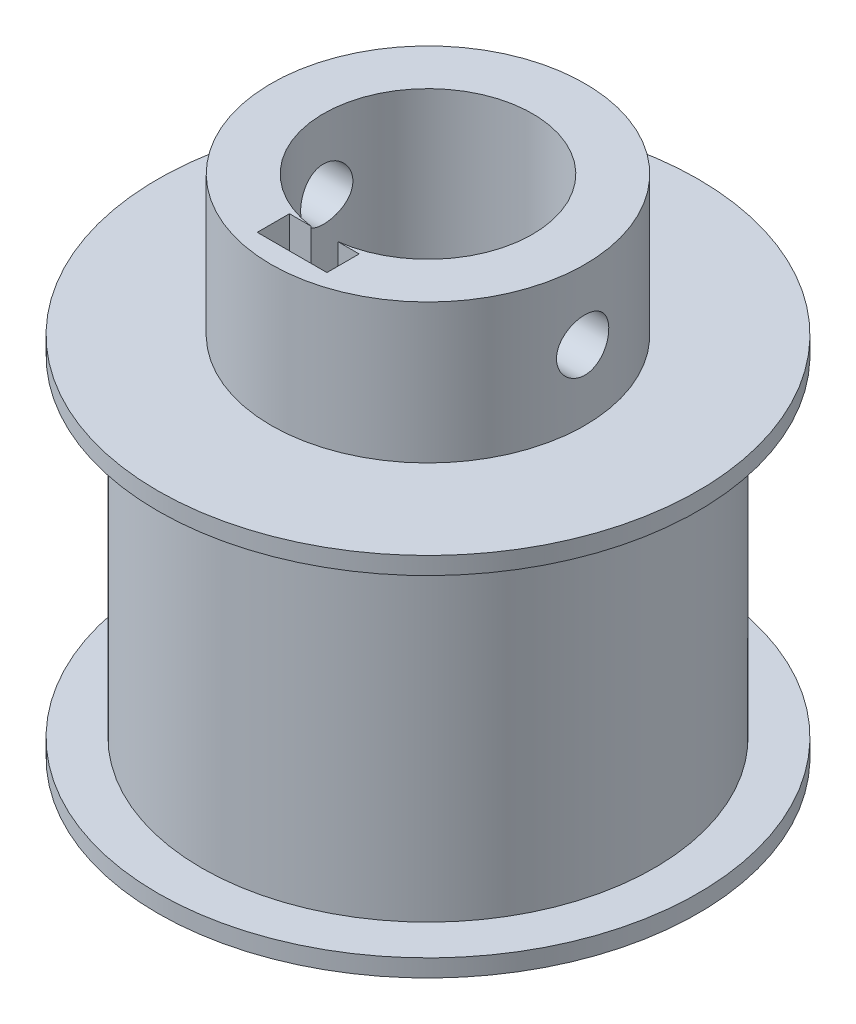
ISO-10303-21;
HEADER;
FILE_DESCRIPTION(('STEP AP214'),'2;1');
FILE_NAME('part.step','',(''),(''),'','','');
FILE_SCHEMA(('AUTOMOTIVE_DESIGN { 1 0 10303 214 1 1 1 1 }'));
ENDSEC;
DATA;
#1=APPLICATION_CONTEXT('core data for automotive mechanical design processes');
#2=APPLICATION_PROTOCOL_DEFINITION('international standard','automotive_design',2000,#1);
#3=PRODUCT_CONTEXT('',#1,'mechanical');
#4=PRODUCT('Part','Part','',(#3));
#5=PRODUCT_RELATED_PRODUCT_CATEGORY('part','',(#4));
#6=PRODUCT_DEFINITION_FORMATION('','',#4);
#7=PRODUCT_DEFINITION_CONTEXT('part definition',#1,'design');
#8=PRODUCT_DEFINITION('design','',#6,#7);
#9=PRODUCT_DEFINITION_SHAPE('','',#8);
#10=(LENGTH_UNIT() NAMED_UNIT(*) SI_UNIT(.MILLI.,.METRE.));
#11=(NAMED_UNIT(*) PLANE_ANGLE_UNIT() SI_UNIT($,.RADIAN.));
#12=(NAMED_UNIT(*) SI_UNIT($,.STERADIAN.) SOLID_ANGLE_UNIT());
#13=UNCERTAINTY_MEASURE_WITH_UNIT(LENGTH_MEASURE(1.E-05),#10,'distance_accuracy_value','');
#14=(GEOMETRIC_REPRESENTATION_CONTEXT(3) GLOBAL_UNCERTAINTY_ASSIGNED_CONTEXT((#13)) GLOBAL_UNIT_ASSIGNED_CONTEXT((#10,
#11,#12)) REPRESENTATION_CONTEXT('',''));
#15=CARTESIAN_POINT('',(0.,0.,0.));
#16=DIRECTION('',(0.,0.,1.));
#17=DIRECTION('',(1.,0.,0.));
#18=AXIS2_PLACEMENT_3D('',#15,#16,#17);
#19=CARTESIAN_POINT('',(17.5108,0.01080000000002,21.4608));
#20=DIRECTION('',(0.,0.,1.));
#21=DIRECTION('',(1.,0.,0.));
#22=AXIS2_PLACEMENT_3D('',#19,#20,#21);
#23=PLANE('',#22);
#24=DIRECTION('',(1.,0.,0.));
#25=VECTOR('',#24,1.);
#26=CARTESIAN_POINT('',(15.5108,29.0108,21.4608));
#27=LINE('',#26,#25);
#28=CARTESIAN_POINT('',(16.283781241687,29.0108,21.4608));
#29=VERTEX_POINT('',#28);
#30=CARTESIAN_POINT('',(17.5108,29.0108,21.4608));
#31=VERTEX_POINT('',#30);
#32=EDGE_CURVE('E79',#29,#31,#27,.T.);
#33=ORIENTED_EDGE('',*,*,#32,.F.);
#34=DIRECTION('',(0.,1.,0.));
#35=VECTOR('',#34,1.);
#36=CARTESIAN_POINT('',(16.283781241687,0.01080000000002,21.4608));
#37=LINE('',#36,#35);
#38=CARTESIAN_POINT('',(16.283781241687,0.01080000000002,21.4608));
#39=VERTEX_POINT('',#38);
#40=EDGE_CURVE('E58',#29,#39,#37,.F.);
#41=ORIENTED_EDGE('',*,*,#40,.T.);
#42=DIRECTION('',(1.,0.,0.));
#43=VECTOR('',#42,1.);
#44=CARTESIAN_POINT('',(17.5108,0.01080000000002,21.4608));
#45=LINE('',#44,#43);
#46=CARTESIAN_POINT('',(17.5108,0.01080000000002,21.4608));
#47=VERTEX_POINT('',#46);
#48=EDGE_CURVE('E97',#39,#47,#45,.T.);
#49=ORIENTED_EDGE('',*,*,#48,.T.);
#50=DIRECTION('',(0.,1.,0.));
#51=VECTOR('',#50,1.);
#52=CARTESIAN_POINT('',(17.5108,0.01080000000002,21.4608));
#53=LINE('',#52,#51);
#54=EDGE_CURVE('E114',#31,#47,#53,.F.);
#55=ORIENTED_EDGE('',*,*,#54,.F.);
#56=EDGE_LOOP('',(#33,#41,#49,#55));
#57=FACE_BOUND('',#56,.T.);
#58=ADVANCED_FACE('F16',(#57),#23,.T.);
#59=CARTESIAN_POINT('',(17.5108,0.01080000000002,21.4608));
#60=DIRECTION('',(0.,0.,1.));
#61=DIRECTION('',(1.,0.,0.));
#62=AXIS2_PLACEMENT_3D('',#59,#60,#61);
#63=PLANE('',#62);
#64=DIRECTION('',(1.,0.,0.));
#65=VECTOR('',#64,1.);
#66=CARTESIAN_POINT('',(15.5108,29.0108,21.4608));
#67=LINE('',#66,#65);
#68=CARTESIAN_POINT('',(13.5108,29.0108,21.4608));
#69=VERTEX_POINT('',#68);
#70=CARTESIAN_POINT('',(14.737818758313,29.0108,21.4608));
#71=VERTEX_POINT('',#70);
#72=EDGE_CURVE('E70',#69,#71,#67,.T.);
#73=ORIENTED_EDGE('',*,*,#72,.F.);
#74=DIRECTION('',(0.,1.,0.));
#75=VECTOR('',#74,1.);
#76=CARTESIAN_POINT('',(13.5108,0.01080000000002,21.4608));
#77=LINE('',#76,#75);
#78=CARTESIAN_POINT('',(13.5108,0.01080000000002,21.4608));
#79=VERTEX_POINT('',#78);
#80=EDGE_CURVE('E109',#69,#79,#77,.F.);
#81=ORIENTED_EDGE('',*,*,#80,.T.);
#82=DIRECTION('',(1.,0.,0.));
#83=VECTOR('',#82,1.);
#84=CARTESIAN_POINT('',(17.5108,0.01080000000002,21.4608));
#85=LINE('',#84,#83);
#86=CARTESIAN_POINT('',(14.737818758313,0.01080000000002,21.4608));
#87=VERTEX_POINT('',#86);
#88=EDGE_CURVE('E35',#79,#87,#85,.T.);
#89=ORIENTED_EDGE('',*,*,#88,.T.);
#90=DIRECTION('',(0.,1.,0.));
#91=VECTOR('',#90,1.);
#92=CARTESIAN_POINT('',(14.737818758313,0.01080000000002,21.4608));
#93=LINE('',#92,#91);
#94=EDGE_CURVE('E66',#87,#71,#93,.T.);
#95=ORIENTED_EDGE('',*,*,#94,.T.);
#96=EDGE_LOOP('',(#73,#81,#89,#95));
#97=FACE_BOUND('',#96,.T.);
#98=ADVANCED_FACE('F67',(#97),#63,.T.);
#99=CARTESIAN_POINT('',(15.5108,29.0108,15.5108));
#100=DIRECTION('',(0.,1.,0.));
#101=DIRECTION('',(0.,0.,1.));
#102=AXIS2_PLACEMENT_3D('',#99,#100,#101);
#103=PLANE('',#102);
#104=DIRECTION('',(0.,0.,1.));
#105=VECTOR('',#104,1.);
#106=CARTESIAN_POINT('',(13.5108,29.0108,21.4608));
#107=LINE('',#106,#105);
#108=CARTESIAN_POINT('',(13.5108,29.0108,23.3108));
#109=VERTEX_POINT('',#108);
#110=EDGE_CURVE('E84',#109,#69,#107,.F.);
#111=ORIENTED_EDGE('',*,*,#110,.T.);
#112=ORIENTED_EDGE('',*,*,#72,.T.);
#113=CARTESIAN_POINT('',(15.5108,29.0108,15.5108));
#114=DIRECTION('',(0.,1.,0.));
#115=DIRECTION('',(0.,0.,1.));
#116=AXIS2_PLACEMENT_3D('',#113,#114,#115);
#117=CIRCLE('',#116,6.);
#118=EDGE_CURVE('E20',#71,#29,#117,.F.);
#119=ORIENTED_EDGE('',*,*,#118,.T.);
#120=ORIENTED_EDGE('',*,*,#32,.T.);
#121=DIRECTION('',(0.,0.,1.));
#122=VECTOR('',#121,1.);
#123=CARTESIAN_POINT('',(17.5108,29.0108,21.4608));
#124=LINE('',#123,#122);
#125=CARTESIAN_POINT('',(17.5108,29.0108,23.3108));
#126=VERTEX_POINT('',#125);
#127=EDGE_CURVE('E117',#126,#31,#124,.F.);
#128=ORIENTED_EDGE('',*,*,#127,.F.);
#129=DIRECTION('',(1.,0.,0.));
#130=VECTOR('',#129,1.);
#131=CARTESIAN_POINT('',(17.5108,29.0108,23.3108));
#132=LINE('',#131,#130);
#133=EDGE_CURVE('E111',#126,#109,#132,.F.);
#134=ORIENTED_EDGE('',*,*,#133,.T.);
#135=EDGE_LOOP('',(#111,#112,#119,#120,#128,#134));
#136=FACE_BOUND('',#135,.T.);
#137=CARTESIAN_POINT('',(15.5108,29.0108,15.5108));
#138=DIRECTION('',(0.,1.,0.));
#139=DIRECTION('',(0.,0.,1.));
#140=AXIS2_PLACEMENT_3D('',#137,#138,#139);
#141=CIRCLE('',#140,9.);
#142=CARTESIAN_POINT('',(15.5108,29.0108,24.5108));
#143=VERTEX_POINT('',#142);
#144=EDGE_CURVE('E105',#143,#143,#141,.F.);
#145=ORIENTED_EDGE('',*,*,#144,.F.);
#146=EDGE_LOOP('',(#145));
#147=FACE_BOUND('',#146,.T.);
#148=ADVANCED_FACE('F80',(#136,#147),#103,.T.);
#149=CARTESIAN_POINT('',(6.5108,25.0108,15.5108));
#150=DIRECTION('',(1.,0.,0.));
#151=DIRECTION('',(0.,0.,-1.));
#152=AXIS2_PLACEMENT_3D('',#149,#150,#151);
#153=CYLINDRICAL_SURFACE('',#152,1.5);
#154=CARTESIAN_POINT('',(6.5108,26.5108,15.5108));
#155=CARTESIAN_POINT('',(6.51080159106698,26.5107961514047,15.5943527114216));
#156=CARTESIAN_POINT('',(6.51197664098711,26.5037893740249,15.6780120210146));
#157=CARTESIAN_POINT('',(6.51655411635386,26.475941917849,15.8430470226757));
#158=CARTESIAN_POINT('',(6.51996106263992,26.4550731595823,15.9244177293981));
#159=CARTESIAN_POINT('',(6.5286201599797,26.4001471365379,16.0823705973422));
#160=CARTESIAN_POINT('',(6.53387001360124,26.3661062871654,16.1589585814877));
#161=CARTESIAN_POINT('',(6.54563631952413,26.2858406777758,16.3053038332559));
#162=CARTESIAN_POINT('',(6.5521522995808,26.2396204581847,16.3750636331377));
#163=CARTESIAN_POINT('',(6.56579991787978,26.1358283034704,16.5064816657416));
#164=CARTESIAN_POINT('',(6.57293639939002,26.0781615217135,16.568064500958));
#165=CARTESIAN_POINT('',(6.58698388063025,25.9533146959676,16.6807305039288));
#166=CARTESIAN_POINT('',(6.59389485439536,25.8861335612216,16.73181246618));
#167=CARTESIAN_POINT('',(6.60675463372876,25.7436571080438,16.8223204607094));
#168=CARTESIAN_POINT('',(6.61269727702731,25.6683145428886,16.8616730700094));
#169=CARTESIAN_POINT('',(6.62288129812685,25.5119735589147,16.9271352493864));
#170=CARTESIAN_POINT('',(6.62712280555173,25.4309755715827,16.9532458285255));
#171=CARTESIAN_POINT('',(6.63337677632509,25.2664119033493,16.9912486100505));
#172=CARTESIAN_POINT('',(6.63540938573322,25.1828766968523,17.0032693978056));
#173=CARTESIAN_POINT('',(6.63707636693402,25.0149519735499,17.0131500384647));
#174=CARTESIAN_POINT('',(6.6367109044897,24.930562516196,17.0110108701537));
#175=CARTESIAN_POINT('',(6.63364143311956,24.7642436227801,16.9927370979549));
#176=CARTESIAN_POINT('',(6.63096158217591,24.6822977914941,16.9767470665801));
#177=CARTESIAN_POINT('',(6.62360306726568,24.5222678526026,16.9314521195448));
#178=CARTESIAN_POINT('',(6.61892431835583,24.4441839092656,16.9021466380403));
#179=CARTESIAN_POINT('',(6.6080689133535,24.2936597906312,16.8309049895289));
#180=CARTESIAN_POINT('',(6.60188511767159,24.2212487573436,16.7889083822726));
#181=CARTESIAN_POINT('',(6.58872194908259,24.0844523597013,16.6935229860824));
#182=CARTESIAN_POINT('',(6.58174257337495,24.0200670235998,16.6401341570457));
#183=CARTESIAN_POINT('',(6.5676693911078,23.9003176428501,16.5227026717186));
#184=CARTESIAN_POINT('',(6.5605752277781,23.8450733312174,16.4585379055535));
#185=CARTESIAN_POINT('',(6.54714719790172,23.7460926015291,16.3217520171686));
#186=CARTESIAN_POINT('',(6.54081367224806,23.702361332855,16.2491271319098));
#187=CARTESIAN_POINT('',(6.52961091004354,23.6276408335381,16.0973506495208));
#188=CARTESIAN_POINT('',(6.5247440884591,23.5966725870682,16.0181885587462));
#189=CARTESIAN_POINT('',(6.5170492442833,23.5485672570789,15.8557918371735));
#190=CARTESIAN_POINT('',(6.51421692505387,23.5314010160818,15.7725661877723));
#191=CARTESIAN_POINT('',(6.51197269704277,23.5178502036116,15.6590816678376));
#192=CARTESIAN_POINT('',(6.51153387329347,23.5152085069824,15.6294925431097));
#193=CARTESIAN_POINT('',(6.51094724177072,23.5116827201921,15.5702067717734));
#194=CARTESIAN_POINT('',(6.51079943423979,23.5107986314957,15.5405101250755));
#195=CARTESIAN_POINT('',(6.51080159106698,23.5108038485953,15.4272472885784));
#196=CARTESIAN_POINT('',(6.51197664098711,23.5178106259751,15.3435879789854));
#197=CARTESIAN_POINT('',(6.51655411635386,23.545658082151,15.1785529773243));
#198=CARTESIAN_POINT('',(6.51996106263992,23.5665268404177,15.0971822706019));
#199=CARTESIAN_POINT('',(6.5286201599797,23.6214528634621,14.9392294026578));
#200=CARTESIAN_POINT('',(6.53387001360125,23.6554937128346,14.8626414185123));
#201=CARTESIAN_POINT('',(6.54563631952413,23.7357593222242,14.7162961667441));
#202=CARTESIAN_POINT('',(6.5521522995808,23.7819795418153,14.6465363668623));
#203=CARTESIAN_POINT('',(6.56579991787978,23.8857716965296,14.5151183342584));
#204=CARTESIAN_POINT('',(6.57293639939001,23.9434384782865,14.453535499042));
#205=CARTESIAN_POINT('',(6.58698388063025,24.0682853040324,14.3408694960712));
#206=CARTESIAN_POINT('',(6.59389485439536,24.1354664387784,14.28978753382));
#207=CARTESIAN_POINT('',(6.60675463372876,24.2779428919562,14.1992795392906));
#208=CARTESIAN_POINT('',(6.61269727702731,24.3532854571114,14.1599269299906));
#209=CARTESIAN_POINT('',(6.62288129812686,24.5096264410853,14.0944647506136));
#210=CARTESIAN_POINT('',(6.62712280555173,24.5906244284173,14.0683541714745));
#211=CARTESIAN_POINT('',(6.6333767763251,24.7551880966507,14.0303513899495));
#212=CARTESIAN_POINT('',(6.63540938573322,24.8387233031477,14.0183306021944));
#213=CARTESIAN_POINT('',(6.63707636693402,25.0066480264501,14.0084499615353));
#214=CARTESIAN_POINT('',(6.6367109044897,25.091037483804,14.0105891298463));
#215=CARTESIAN_POINT('',(6.63364143311956,25.2573563772199,14.0288629020451));
#216=CARTESIAN_POINT('',(6.63096158217591,25.3393022085059,14.0448529334199));
#217=CARTESIAN_POINT('',(6.62360306726568,25.4993321473974,14.0901478804552));
#218=CARTESIAN_POINT('',(6.61892431835583,25.5774160907344,14.1194533619597));
#219=CARTESIAN_POINT('',(6.6080689133535,25.7279402093688,14.1906950104711));
#220=CARTESIAN_POINT('',(6.60188511767159,25.8003512426564,14.2326916177274));
#221=CARTESIAN_POINT('',(6.58872194908259,25.9371476402987,14.3280770139176));
#222=CARTESIAN_POINT('',(6.58174257337495,26.0015329764002,14.3814658429543));
#223=CARTESIAN_POINT('',(6.5676693911078,26.1212823571499,14.4988973282814));
#224=CARTESIAN_POINT('',(6.5605752277781,26.1765266687825,14.5630620944465));
#225=CARTESIAN_POINT('',(6.54714719790172,26.2755073984709,14.6998479828314));
#226=CARTESIAN_POINT('',(6.54081367224806,26.319238667145,14.7724728680902));
#227=CARTESIAN_POINT('',(6.52961091004354,26.3939591664619,14.9242493504793));
#228=CARTESIAN_POINT('',(6.5247440884591,26.4249274129318,15.0034114412538));
#229=CARTESIAN_POINT('',(6.5170492442833,26.4730327429211,15.1658081628265));
#230=CARTESIAN_POINT('',(6.51421692505387,26.4901989839182,15.2490338122277));
#231=CARTESIAN_POINT('',(6.51197269704277,26.5037497963884,15.3625183321624));
#232=CARTESIAN_POINT('',(6.51153387329347,26.5063914930176,15.3921074568903));
#233=CARTESIAN_POINT('',(6.51094724177072,26.5099172798079,15.4513932282266));
#234=CARTESIAN_POINT('',(6.51079943423979,26.5108013685043,15.4810898749245));
#235=CARTESIAN_POINT('',(6.5108,26.5108,15.5108));
#236=B_SPLINE_CURVE_WITH_KNOTS('',3,(#154,#155,#156,#157,#158,#159,#160,#161,#162,#163,#164,
#165,#166,#167,#168,#169,#170,#171,#172,#173,#174,#175,#176,#177,#178,#179,#180,#181,#182,#183,
#184,#185,#186,#187,#188,#189,#190,#191,#192,#193,#194,#195,#196,#197,#198,#199,#200,#201,#202,
#203,#204,#205,#206,#207,#208,#209,#210,#211,#212,#213,#214,#215,#216,#217,#218,#219,#220,#221,
#222,#223,#224,#225,#226,#227,#228,#229,#230,#231,#232,#233,#234,#235),.UNSPECIFIED.,.T.,.F.,(4,
2,2,2,2,2,2,2,2,2,2,2,2,2,2,2,2,2,2,2,2,2,2,2,2,2,2,2,2,2,2,2,2,2,2,2,2,2,2,2,4),(0.,
0.250544729836472,0.501598528708722,0.752340460198052,1.00298904790495,1.25580842081458,
1.5086568012745,1.76305622567337,2.01743626154988,2.26947625472833,2.52149882621608,
2.7709221081901,3.02035599047344,3.27099701618203,3.52163892420827,3.77534079650553,
4.02915594874088,4.28338675922352,4.53707907181323,4.62616904783463,4.71525909810113,
4.96580382793761,5.21685762680986,5.46759955829918,5.71824814600608,5.97106751891572,
6.22391589937563,6.4783153237745,6.73269535965102,6.98473535282946,7.23675792431721,
7.48618120629123,7.73561508857457,7.98625611428316,8.2368980223094,8.49059989460666,
8.74441504684201,8.99864585732466,9.25233816991437,9.34142814593576,9.43051819620226),.UNSPECIFIED.);
#237=CARTESIAN_POINT('',(6.5108,26.5108,15.5108));
#238=VERTEX_POINT('',#237);
#239=EDGE_CURVE('E163',#238,#238,#236,.T.);
#240=ORIENTED_EDGE('',*,*,#239,.F.);
#241=EDGE_LOOP('',(#240));
#242=FACE_BOUND('',#241,.T.);
#243=CARTESIAN_POINT('',(9.5108,26.5108,15.5108));
#244=CARTESIAN_POINT('',(9.51080245758254,26.5107957663319,15.4280198793549));
#245=CARTESIAN_POINT('',(9.51253217458299,26.5039171016735,15.3451424105293));
#246=CARTESIAN_POINT('',(9.51927199447492,26.4766023022915,15.1816889268463));
#247=CARTESIAN_POINT('',(9.52428827332964,26.4561406420396,15.1011175435798));
#248=CARTESIAN_POINT('',(9.53704474300738,26.4023566655161,14.9447705636348));
#249=CARTESIAN_POINT('',(9.54478026291396,26.3690563930566,14.8689870044665));
#250=CARTESIAN_POINT('',(9.56214936192764,26.2906054241599,14.7241068362405));
#251=CARTESIAN_POINT('',(9.57178245019384,26.2454577912591,14.6550085048037));
#252=CARTESIAN_POINT('',(9.59212558646263,26.1436006194547,14.5240001175134));
#253=CARTESIAN_POINT('',(9.60285234019346,26.0866915529213,14.4622477631136));
#254=CARTESIAN_POINT('',(9.62406322171303,25.9633514432626,14.3490538380941));
#255=CARTESIAN_POINT('',(9.63454730853776,25.8969188059075,14.2976139972366));
#256=CARTESIAN_POINT('',(9.65425228238363,25.7552044927962,14.2057732915202));
#257=CARTESIAN_POINT('',(9.66345212698148,25.6798061813286,14.165547475053));
#258=CARTESIAN_POINT('',(9.67930510366259,25.5230509561155,14.0984028778293));
#259=CARTESIAN_POINT('',(9.68595866258332,25.4416950437775,14.0714818665487));
#260=CARTESIAN_POINT('',(9.69579522982358,25.2770565517088,14.0322451761285));
#261=CARTESIAN_POINT('',(9.69904508529589,25.1938452055187,14.0196477468486));
#262=CARTESIAN_POINT('',(9.70190637501459,25.026431533375,14.0085382232883));
#263=CARTESIAN_POINT('',(9.70151839678129,24.9422293696349,14.0100238545545));
#264=CARTESIAN_POINT('',(9.69720795209976,24.7773844606726,14.0268134465595));
#265=CARTESIAN_POINT('',(9.6933713953941,24.6967049113014,14.0417815554697));
#266=CARTESIAN_POINT('',(9.68273294824195,24.5390394584799,14.0845756345605));
#267=CARTESIAN_POINT('',(9.67593082701573,24.4620538430086,14.1124026054255));
#268=CARTESIAN_POINT('',(9.66004859302395,24.3130594749048,14.1804116472342));
#269=CARTESIAN_POINT('',(9.65094611312295,24.2411090046106,14.2207159597363));
#270=CARTESIAN_POINT('',(9.63150219704708,24.1048769607265,14.3124472604191));
#271=CARTESIAN_POINT('',(9.62116062701485,24.0405962171875,14.3638754507825));
#272=CARTESIAN_POINT('',(9.60004333006457,23.9196086514956,14.4781247052392));
#273=CARTESIAN_POINT('',(9.58926360560389,23.8631681440368,14.5412273705203));
#274=CARTESIAN_POINT('',(9.56874425282195,23.7615967536182,14.6761604768549));
#275=CARTESIAN_POINT('',(9.55900507295203,23.7164707357561,14.7479946527109));
#276=CARTESIAN_POINT('',(9.54161435262939,23.6387125827799,14.8987518156011));
#277=CARTESIAN_POINT('',(9.53397173002682,23.6061335872479,14.9777032426063));
#278=CARTESIAN_POINT('',(9.52171205514241,23.5548457088998,15.140099612562));
#279=CARTESIAN_POINT('',(9.51708870321027,23.5361079358506,15.2235348037402));
#280=CARTESIAN_POINT('',(9.51309334608196,23.5199954791034,15.3415140264393));
#281=CARTESIAN_POINT('',(9.51223545866059,23.5165505074057,15.375268518348));
#282=CARTESIAN_POINT('',(9.51108828118977,23.5119518973194,15.4429432195535));
#283=CARTESIAN_POINT('',(9.51079899248849,23.5107982643638,15.4768634292429));
#284=CARTESIAN_POINT('',(9.51080245758253,23.5108042336681,15.5935801206451));
#285=CARTESIAN_POINT('',(9.51253217458299,23.5176828983265,15.6764575894707));
#286=CARTESIAN_POINT('',(9.51927199447493,23.5449976977085,15.8399110731537));
#287=CARTESIAN_POINT('',(9.52428827332964,23.5654593579604,15.9204824564202));
#288=CARTESIAN_POINT('',(9.53704474300738,23.6192433344839,16.0768294363652));
#289=CARTESIAN_POINT('',(9.54478026291396,23.6525436069434,16.1526129955335));
#290=CARTESIAN_POINT('',(9.56214936192764,23.7309945758401,16.2974931637595));
#291=CARTESIAN_POINT('',(9.57178245019384,23.7761422087409,16.3665914951963));
#292=CARTESIAN_POINT('',(9.59212558646263,23.8779993805453,16.4975998824866));
#293=CARTESIAN_POINT('',(9.60285234019346,23.9349084470787,16.5593522368864));
#294=CARTESIAN_POINT('',(9.62406322171303,24.0582485567374,16.6725461619059));
#295=CARTESIAN_POINT('',(9.63454730853776,24.1246811940925,16.7239860027634));
#296=CARTESIAN_POINT('',(9.65425228238363,24.2663955072038,16.8158267084798));
#297=CARTESIAN_POINT('',(9.66345212698148,24.3417938186714,16.856052524947));
#298=CARTESIAN_POINT('',(9.67930510366259,24.4985490438845,16.9231971221707));
#299=CARTESIAN_POINT('',(9.68595866258332,24.5799049562225,16.9501181334513));
#300=CARTESIAN_POINT('',(9.69579522982358,24.7445434482912,16.9893548238715));
#301=CARTESIAN_POINT('',(9.69904508529589,24.8277547944813,17.0019522531514));
#302=CARTESIAN_POINT('',(9.70190637501459,24.995168466625,17.0130617767117));
#303=CARTESIAN_POINT('',(9.70151839678129,25.0793706303651,17.0115761454455));
#304=CARTESIAN_POINT('',(9.69720795209976,25.2442155393274,16.9947865534405));
#305=CARTESIAN_POINT('',(9.6933713953941,25.3248950886986,16.9798184445303));
#306=CARTESIAN_POINT('',(9.68273294824195,25.4825605415201,16.9370243654395));
#307=CARTESIAN_POINT('',(9.67593082701574,25.5595461569914,16.9091973945745));
#308=CARTESIAN_POINT('',(9.66004859302395,25.7085405250952,16.8411883527658));
#309=CARTESIAN_POINT('',(9.65094611312295,25.7804909953894,16.8008840402637));
#310=CARTESIAN_POINT('',(9.63150219704708,25.9167230392735,16.7091527395809));
#311=CARTESIAN_POINT('',(9.62116062701485,25.9810037828125,16.6577245492175));
#312=CARTESIAN_POINT('',(9.60004333006457,26.1019913485044,16.5434752947608));
#313=CARTESIAN_POINT('',(9.58926360560389,26.1584318559632,16.4803726294797));
#314=CARTESIAN_POINT('',(9.56874425282195,26.2600032463817,16.3454395231451));
#315=CARTESIAN_POINT('',(9.55900507295202,26.3051292642439,16.2736053472891));
#316=CARTESIAN_POINT('',(9.54161435262939,26.3828874172201,16.1228481843989));
#317=CARTESIAN_POINT('',(9.53397173002682,26.4154664127521,16.0438967573937));
#318=CARTESIAN_POINT('',(9.52171205514242,26.4667542911002,15.881500387438));
#319=CARTESIAN_POINT('',(9.51708870321027,26.4854920641494,15.7980651962598));
#320=CARTESIAN_POINT('',(9.51309334608196,26.5016045208966,15.6800859735607));
#321=CARTESIAN_POINT('',(9.51223545866059,26.5050494925943,15.646331481652));
#322=CARTESIAN_POINT('',(9.51108828118977,26.5096481026806,15.5786567804465));
#323=CARTESIAN_POINT('',(9.5107989924885,26.5108017356362,15.5447365707571));
#324=CARTESIAN_POINT('',(9.5108,26.5108,15.5108));
#325=B_SPLINE_CURVE_WITH_KNOTS('',3,(#243,#244,#245,#246,#247,#248,#249,#250,#251,#252,#253,
#254,#255,#256,#257,#258,#259,#260,#261,#262,#263,#264,#265,#266,#267,#268,#269,#270,#271,#272,
#273,#274,#275,#276,#277,#278,#279,#280,#281,#282,#283,#284,#285,#286,#287,#288,#289,#290,#291,
#292,#293,#294,#295,#296,#297,#298,#299,#300,#301,#302,#303,#304,#305,#306,#307,#308,#309,#310,
#311,#312,#313,#314,#315,#316,#317,#318,#319,#320,#321,#322,#323,#324),.UNSPECIFIED.,.T.,.F.,(4,
2,2,2,2,2,2,2,2,2,2,2,2,2,2,2,2,2,2,2,2,2,2,2,2,2,2,2,2,2,2,2,2,2,2,2,2,2,2,2,4),(0.,
0.248210237284082,0.496888243351019,0.745141158915023,0.993329943428357,1.24613743666848,
1.49898729898251,1.75558747352589,2.0121446149559,2.26356280169065,2.51494038438458,
2.76022416550306,3.00552703797135,3.25331357850536,3.50112691128606,3.75596420888856,
4.01091089633811,4.26692577032777,4.52240475290885,4.62416087795859,4.72591724427668,
4.97412748156076,5.2228054876277,5.47105840319171,5.71924718770504,5.97205468094515,
6.22490454325919,6.48150471780257,6.73806185923258,6.98948004596733,7.24085762866126,
7.48614140977974,7.73144428224803,7.97923082278205,8.22704415556275,8.48188145316524,
8.73682814061478,8.99284301460444,9.24832199718553,9.35007812223528,9.45183448855337),.UNSPECIFIED.);
#326=CARTESIAN_POINT('',(9.5108,26.5108,15.5108));
#327=VERTEX_POINT('',#326);
#328=EDGE_CURVE('E86',#327,#327,#325,.T.);
#329=ORIENTED_EDGE('',*,*,#328,.F.);
#330=EDGE_LOOP('',(#329));
#331=FACE_BOUND('',#330,.T.);
#332=ADVANCED_FACE('F197',(#242,#331),#153,.F.);
#333=CARTESIAN_POINT('',(24.5108,25.0108,15.5108));
#334=DIRECTION('',(-1.,0.,0.));
#335=DIRECTION('',(0.,0.,1.));
#336=AXIS2_PLACEMENT_3D('',#333,#334,#335);
#337=CYLINDRICAL_SURFACE('',#336,1.5);
#338=CARTESIAN_POINT('',(24.5108,26.5108,15.5108));
#339=CARTESIAN_POINT('',(24.510798408933,26.5107961514047,15.4272472885784));
#340=CARTESIAN_POINT('',(24.5096233590129,26.5037893740249,15.3435879789854));
#341=CARTESIAN_POINT('',(24.5050458836461,26.475941917849,15.1785529773243));
#342=CARTESIAN_POINT('',(24.5016389373601,26.4550731595823,15.0971822706019));
#343=CARTESIAN_POINT('',(24.4929798400203,26.4001471365379,14.9392294026578));
#344=CARTESIAN_POINT('',(24.4877299863988,26.3661062871654,14.8626414185123));
#345=CARTESIAN_POINT('',(24.4759636804759,26.2858406777758,14.7162961667441));
#346=CARTESIAN_POINT('',(24.4694477004192,26.2396204581847,14.6465363668623));
#347=CARTESIAN_POINT('',(24.4558000821202,26.1358283034704,14.5151183342584));
#348=CARTESIAN_POINT('',(24.44866360061,26.0781615217135,14.453535499042));
#349=CARTESIAN_POINT('',(24.4346161193698,25.9533146959676,14.3408694960712));
#350=CARTESIAN_POINT('',(24.4277051456046,25.8861335612216,14.28978753382));
#351=CARTESIAN_POINT('',(24.4148453662712,25.7436571080438,14.1992795392906));
#352=CARTESIAN_POINT('',(24.4089027229727,25.6683145428886,14.1599269299906));
#353=CARTESIAN_POINT('',(24.3987187018731,25.5119735589147,14.0944647506136));
#354=CARTESIAN_POINT('',(24.3944771944483,25.4309755715827,14.0683541714745));
#355=CARTESIAN_POINT('',(24.3882232236749,25.2664119033493,14.0303513899495));
#356=CARTESIAN_POINT('',(24.3861906142668,25.1828766968523,14.0183306021944));
#357=CARTESIAN_POINT('',(24.384523633066,25.0149519735499,14.0084499615353));
#358=CARTESIAN_POINT('',(24.3848890955103,24.930562516196,14.0105891298463));
#359=CARTESIAN_POINT('',(24.3879585668804,24.7642436227801,14.0288629020451));
#360=CARTESIAN_POINT('',(24.3906384178241,24.6822977914941,14.0448529334199));
#361=CARTESIAN_POINT('',(24.3979969327343,24.5222678526026,14.0901478804552));
#362=CARTESIAN_POINT('',(24.4026756816442,24.4441839092656,14.1194533619597));
#363=CARTESIAN_POINT('',(24.4135310866465,24.2936597906312,14.1906950104711));
#364=CARTESIAN_POINT('',(24.4197148823284,24.2212487573436,14.2326916177274));
#365=CARTESIAN_POINT('',(24.4328780509174,24.0844523597013,14.3280770139176));
#366=CARTESIAN_POINT('',(24.439857426625,24.0200670235998,14.3814658429543));
#367=CARTESIAN_POINT('',(24.4539306088922,23.9003176428501,14.4988973282814));
#368=CARTESIAN_POINT('',(24.4610247722219,23.8450733312174,14.5630620944465));
#369=CARTESIAN_POINT('',(24.4744528020983,23.7460926015291,14.6998479828314));
#370=CARTESIAN_POINT('',(24.4807863277519,23.702361332855,14.7724728680902));
#371=CARTESIAN_POINT('',(24.4919890899565,23.6276408335381,14.9242493504792));
#372=CARTESIAN_POINT('',(24.4968559115409,23.5966725870682,15.0034114412538));
#373=CARTESIAN_POINT('',(24.5045507557167,23.5485672570789,15.1658081628265));
#374=CARTESIAN_POINT('',(24.5073830749461,23.5314010160818,15.2490338122277));
#375=CARTESIAN_POINT('',(24.5096273029572,23.5178502036116,15.3625183321624));
#376=CARTESIAN_POINT('',(24.5100661267065,23.5152085069824,15.3921074568903));
#377=CARTESIAN_POINT('',(24.5106527582293,23.5116827201921,15.4513932282266));
#378=CARTESIAN_POINT('',(24.5108005657602,23.5107986314957,15.4810898749245));
#379=CARTESIAN_POINT('',(24.510798408933,23.5108038485953,15.5943527114216));
#380=CARTESIAN_POINT('',(24.5096233590129,23.5178106259751,15.6780120210146));
#381=CARTESIAN_POINT('',(24.5050458836461,23.545658082151,15.8430470226757));
#382=CARTESIAN_POINT('',(24.5016389373601,23.5665268404177,15.9244177293981));
#383=CARTESIAN_POINT('',(24.4929798400203,23.6214528634621,16.0823705973422));
#384=CARTESIAN_POINT('',(24.4877299863988,23.6554937128346,16.1589585814877));
#385=CARTESIAN_POINT('',(24.4759636804759,23.7357593222242,16.3053038332559));
#386=CARTESIAN_POINT('',(24.4694477004192,23.7819795418152,16.3750636331377));
#387=CARTESIAN_POINT('',(24.4558000821202,23.8857716965296,16.5064816657416));
#388=CARTESIAN_POINT('',(24.44866360061,23.9434384782865,16.568064500958));
#389=CARTESIAN_POINT('',(24.4346161193698,24.0682853040324,16.6807305039288));
#390=CARTESIAN_POINT('',(24.4277051456046,24.1354664387784,16.73181246618));
#391=CARTESIAN_POINT('',(24.4148453662712,24.2779428919562,16.8223204607094));
#392=CARTESIAN_POINT('',(24.4089027229727,24.3532854571114,16.8616730700094));
#393=CARTESIAN_POINT('',(24.3987187018731,24.5096264410853,16.9271352493864));
#394=CARTESIAN_POINT('',(24.3944771944483,24.5906244284173,16.9532458285255));
#395=CARTESIAN_POINT('',(24.3882232236749,24.7551880966507,16.9912486100505));
#396=CARTESIAN_POINT('',(24.3861906142668,24.8387233031477,17.0032693978056));
#397=CARTESIAN_POINT('',(24.384523633066,25.0066480264501,17.0131500384647));
#398=CARTESIAN_POINT('',(24.3848890955103,25.091037483804,17.0110108701537));
#399=CARTESIAN_POINT('',(24.3879585668804,25.2573563772199,16.9927370979549));
#400=CARTESIAN_POINT('',(24.3906384178241,25.3393022085059,16.9767470665801));
#401=CARTESIAN_POINT('',(24.3979969327343,25.4993321473974,16.9314521195448));
#402=CARTESIAN_POINT('',(24.4026756816442,25.5774160907343,16.9021466380403));
#403=CARTESIAN_POINT('',(24.4135310866465,25.7279402093688,16.8309049895289));
#404=CARTESIAN_POINT('',(24.4197148823284,25.8003512426564,16.7889083822726));
#405=CARTESIAN_POINT('',(24.4328780509174,25.9371476402987,16.6935229860824));
#406=CARTESIAN_POINT('',(24.439857426625,26.0015329764002,16.6401341570457));
#407=CARTESIAN_POINT('',(24.4539306088922,26.1212823571499,16.5227026717186));
#408=CARTESIAN_POINT('',(24.4610247722219,26.1765266687826,16.4585379055535));
#409=CARTESIAN_POINT('',(24.4744528020983,26.2755073984709,16.3217520171686));
#410=CARTESIAN_POINT('',(24.4807863277519,26.319238667145,16.2491271319098));
#411=CARTESIAN_POINT('',(24.4919890899565,26.3939591664619,16.0973506495207));
#412=CARTESIAN_POINT('',(24.4968559115409,26.4249274129318,16.0181885587462));
#413=CARTESIAN_POINT('',(24.5045507557167,26.4730327429211,15.8557918371735));
#414=CARTESIAN_POINT('',(24.5073830749461,26.4901989839182,15.7725661877723));
#415=CARTESIAN_POINT('',(24.5096273029572,26.5037497963884,15.6590816678376));
#416=CARTESIAN_POINT('',(24.5100661267065,26.5063914930176,15.6294925431097));
#417=CARTESIAN_POINT('',(24.5106527582293,26.5099172798079,15.5702067717734));
#418=CARTESIAN_POINT('',(24.5108005657602,26.5108013685043,15.5405101250755));
#419=CARTESIAN_POINT('',(24.5108,26.5108,15.5108));
#420=B_SPLINE_CURVE_WITH_KNOTS('',3,(#338,#339,#340,#341,#342,#343,#344,#345,#346,#347,#348,
#349,#350,#351,#352,#353,#354,#355,#356,#357,#358,#359,#360,#361,#362,#363,#364,#365,#366,#367,
#368,#369,#370,#371,#372,#373,#374,#375,#376,#377,#378,#379,#380,#381,#382,#383,#384,#385,#386,
#387,#388,#389,#390,#391,#392,#393,#394,#395,#396,#397,#398,#399,#400,#401,#402,#403,#404,#405,
#406,#407,#408,#409,#410,#411,#412,#413,#414,#415,#416,#417,#418,#419),.UNSPECIFIED.,.T.,.F.,(4,
2,2,2,2,2,2,2,2,2,2,2,2,2,2,2,2,2,2,2,2,2,2,2,2,2,2,2,2,2,2,2,2,2,2,2,2,2,2,2,4),(0.,
0.250544729836472,0.50159852870872,0.752340460198052,1.00298904790494,1.25580842081458,
1.50865680127449,1.76305622567337,2.01743626154988,2.26947625472833,2.52149882621607,
2.7709221081901,3.02035599047344,3.27099701618202,3.52163892420827,3.77534079650553,
4.02915594874087,4.28338675922351,4.53707907181323,4.62616904783463,4.71525909810113,
4.9658038279376,5.21685762680985,5.46759955829918,5.71824814600608,5.97106751891571,
6.22391589937563,6.4783153237745,6.73269535965101,6.98473535282946,7.2367579243172,
7.48618120629123,7.73561508857457,7.98625611428315,8.2368980223094,8.49059989460666,
8.74441504684201,8.99864585732465,9.25233816991436,9.34142814593576,9.43051819620226),.UNSPECIFIED.);
#421=CARTESIAN_POINT('',(24.5108,26.5108,15.5108));
#422=VERTEX_POINT('',#421);
#423=EDGE_CURVE('E155',#422,#422,#420,.T.);
#424=ORIENTED_EDGE('',*,*,#423,.F.);
#425=EDGE_LOOP('',(#424));
#426=FACE_BOUND('',#425,.T.);
#427=CARTESIAN_POINT('',(21.5108,26.5108,15.5108));
#428=CARTESIAN_POINT('',(21.5107985986801,26.5107976742618,15.5936760886697));
#429=CARTESIAN_POINT('',(21.5090657813183,26.5039084492262,15.6765781578308));
#430=CARTESIAN_POINT('',(21.5023211382989,26.476574848693,15.8400063237705));
#431=CARTESIAN_POINT('',(21.4973074541997,26.4561227904622,15.9205310468707));
#432=CARTESIAN_POINT('',(21.4845562633204,26.4023607465379,16.0768208721826));
#433=CARTESIAN_POINT('',(21.4768220284209,26.3690662012847,16.15259156343));
#434=CARTESIAN_POINT('',(21.4594534380759,26.2906186099552,16.2974721319044));
#435=CARTESIAN_POINT('',(21.4498190185405,26.2454651638811,16.3665817843488));
#436=CARTESIAN_POINT('',(21.429474135918,26.1435992103458,16.4976019273009));
#437=CARTESIAN_POINT('',(21.4187470714853,26.0866884250408,16.5593556900611));
#438=CARTESIAN_POINT('',(21.3975362011753,25.9633477950911,16.6725489272033));
#439=CARTESIAN_POINT('',(21.3870524228835,25.8969168770535,16.7239872369491));
#440=CARTESIAN_POINT('',(21.3673477569971,25.7552047732626,16.815826542799));
#441=CARTESIAN_POINT('',(21.3581479447061,25.6798067691896,16.8560522159254));
#442=CARTESIAN_POINT('',(21.3422949481222,25.5230515883416,16.9231969085505));
#443=CARTESIAN_POINT('',(21.3356413567279,25.4416953666742,16.9501180554393));
#444=CARTESIAN_POINT('',(21.3258047671755,25.2770565017975,16.9893548368043));
#445=CARTESIAN_POINT('',(21.3225549107543,25.1938451039502,17.0019522683333));
#446=CARTESIAN_POINT('',(21.3196936253774,25.026431430986,17.0130617750679));
#447=CARTESIAN_POINT('',(21.3200816044864,24.9422293193014,17.011576141818));
#448=CARTESIAN_POINT('',(21.3243920549662,24.7773841922555,16.9947865246393));
#449=CARTESIAN_POINT('',(21.3282286300188,24.6967043785349,16.9798183401905));
#450=CARTESIAN_POINT('',(21.3388670967648,24.5390389490887,16.9370241869031));
#451=CARTESIAN_POINT('',(21.345669199707,24.462053596971,16.9091973020694));
#452=CARTESIAN_POINT('',(21.3615511390419,24.3130619837479,16.8411894779372));
#453=CARTESIAN_POINT('',(21.3706532746942,24.2411138282104,16.8008866672329));
#454=CARTESIAN_POINT('',(21.3900971084639,24.1048812902432,16.709156276015));
#455=CARTESIAN_POINT('',(21.4004390233474,24.0405982519327,16.6577267488088));
#456=CARTESIAN_POINT('',(21.4215588053978,23.9195963843056,16.5434634246812));
#457=CARTESIAN_POINT('',(21.4323406947797,23.8631455099387,16.4803462581659));
#458=CARTESIAN_POINT('',(21.4528596557879,23.7615787575361,16.3454119175037));
#459=CARTESIAN_POINT('',(21.4625966954942,23.7164632257364,16.2735944777079));
#460=CARTESIAN_POINT('',(21.4799773209418,23.6387494137756,16.1229158886814));
#461=CARTESIAN_POINT('',(21.4876136012772,23.6061946597456,16.0440313932086));
#462=CARTESIAN_POINT('',(21.4998791699142,23.5548826942904,15.8816760081429));
#463=CARTESIAN_POINT('',(21.5045090333928,23.5361228435819,15.7982059991505));
#464=CARTESIAN_POINT('',(21.5101549927137,23.5133424344412,15.63133997039));
#465=CARTESIAN_POINT('',(21.5112605350828,23.5089569739247,15.5479967199882));
#466=CARTESIAN_POINT('',(21.5099880481445,23.5140490020555,15.3817671251985));
#467=CARTESIAN_POINT('',(21.5076103324185,23.5235252427991,15.2988807403554));
#468=CARTESIAN_POINT('',(21.4996958112736,23.5557709083914,15.1371857312235));
#469=CARTESIAN_POINT('',(21.4942063418581,23.578341263477,15.0583348810312));
#470=CARTESIAN_POINT('',(21.4806870663413,23.6359070840284,14.9055427075475));
#471=CARTESIAN_POINT('',(21.4726570036989,23.6709038043132,14.8316018809674));
#472=CARTESIAN_POINT('',(21.4547330792631,23.7530361288747,14.6892768655702));
#473=CARTESIAN_POINT('',(21.4448086736693,23.8003761123968,14.6210145581642));
#474=CARTESIAN_POINT('',(21.4242450918742,23.905589908797,14.4932733863568));
#475=CARTESIAN_POINT('',(21.413605792517,23.9634655396169,14.433796041027));
#476=CARTESIAN_POINT('',(21.3924895696077,24.0898019608445,14.3238094319273));
#477=CARTESIAN_POINT('',(21.3820230418728,24.1584877030024,14.273556132378));
#478=CARTESIAN_POINT('',(21.3627287837724,24.3035326344657,14.1852892409873));
#479=CARTESIAN_POINT('',(21.3539009806703,24.3798914829598,14.1472751058421));
#480=CARTESIAN_POINT('',(21.3389809473466,24.5377057224131,14.0848485793907));
#481=CARTESIAN_POINT('',(21.3328725529191,24.619127628344,14.0603556033459));
#482=CARTESIAN_POINT('',(21.3240674409018,24.7851096378891,14.0254543400462));
#483=CARTESIAN_POINT('',(21.3213699771994,24.8696690510325,14.0150429725213));
#484=CARTESIAN_POINT('',(21.3197490120396,25.0369210238552,14.008761409666));
#485=CARTESIAN_POINT('',(21.3207193272826,25.1195974351247,14.0124821022199));
#486=CARTESIAN_POINT('',(21.3260790900784,25.283103888668,14.0334227216871));
#487=CARTESIAN_POINT('',(21.3304684689186,25.3639339680137,14.0506423773132));
#488=CARTESIAN_POINT('',(21.3421126068272,25.5210084590654,14.0978686805572));
#489=CARTESIAN_POINT('',(21.3493501523631,25.5972773052402,14.1277985953196));
#490=CARTESIAN_POINT('',(21.3658775572483,25.7437653827137,14.1995350863949));
#491=CARTESIAN_POINT('',(21.3751677012077,25.8139837731869,14.2413433099658));
#492=CARTESIAN_POINT('',(21.3950563426351,25.948354629002,14.3369322513629));
#493=CARTESIAN_POINT('',(21.4056826483176,26.012301073424,14.3909968370877));
#494=CARTESIAN_POINT('',(21.4268802724629,26.1303470447954,14.5090106288103));
#495=CARTESIAN_POINT('',(21.4374515772706,26.184444230113,14.5729621787389));
#496=CARTESIAN_POINT('',(21.4575765564766,26.2822113085646,14.7103324132974));
#497=CARTESIAN_POINT('',(21.4671083336587,26.3256746136716,14.7839015776836));
#498=CARTESIAN_POINT('',(21.4838492497512,26.3995474629405,14.9375339404895));
#499=CARTESIAN_POINT('',(21.4910600519978,26.4299663606485,15.0175924365633));
#500=CARTESIAN_POINT('',(21.5012805956554,26.4723718303296,15.1663897467565));
#501=CARTESIAN_POINT('',(21.5048258505269,26.4867512430534,15.2344198290919));
#502=CARTESIAN_POINT('',(21.5095860523195,26.5059659436219,15.3718939284637));
#503=CARTESIAN_POINT('',(21.5108011745089,26.5108019493053,15.4413378387574));
#504=CARTESIAN_POINT('',(21.5108,26.5108,15.5108));
#505=B_SPLINE_CURVE_WITH_KNOTS('',3,(#427,#428,#429,#430,#431,#432,#433,#434,#435,#436,#437,
#438,#439,#440,#441,#442,#443,#444,#445,#446,#447,#448,#449,#450,#451,#452,#453,#454,#455,#456,
#457,#458,#459,#460,#461,#462,#463,#464,#465,#466,#467,#468,#469,#470,#471,#472,#473,#474,#475,
#476,#477,#478,#479,#480,#481,#482,#483,#484,#485,#486,#487,#488,#489,#490,#491,#492,#493,#494,
#495,#496,#497,#498,#499,#500,#501,#502,#503,#504),.UNSPECIFIED.,.T.,.F.,(4,2,2,2,2,2,2,2,2,2,2,
2,2,2,2,2,2,2,2,2,2,2,2,2,2,2,2,2,2,2,2,2,2,2,2,2,2,2,4),(0.,0.248373712471888,
0.496888237763899,0.745104902286105,0.993329940169327,1.24614435437139,1.49898729580061,
1.75558647545807,2.01214461169369,2.26356295099431,2.51494038112697,2.76022497007018,
3.00552703466038,3.25330527873879,3.50112690836162,3.75601500969019,4.01091089558247,
4.26668229009113,4.52240473688643,4.77158308949276,5.02073901112743,5.26620274514037,
5.5116912732229,5.76153587565352,6.01142363008019,6.26744509204476,6.52345518749508,
6.77792254614036,7.03233423252408,7.27943780398612,7.52653640956034,7.77216400559447,
8.01782568136901,8.2698957640991,8.52202569770417,8.77872185499588,9.0352336382135,
9.24342242942149,9.45159556043039),.UNSPECIFIED.);
#506=CARTESIAN_POINT('',(21.5108,26.5108,15.5108));
#507=VERTEX_POINT('',#506);
#508=EDGE_CURVE('E72',#507,#507,#505,.T.);
#509=ORIENTED_EDGE('',*,*,#508,.F.);
#510=EDGE_LOOP('',(#509));
#511=FACE_BOUND('',#510,.T.);
#512=ADVANCED_FACE('F169',(#426,#511),#337,.F.);
#513=CARTESIAN_POINT('',(15.5108,0.01080000000002,15.5108));
#514=DIRECTION('',(0.,1.,0.));
#515=DIRECTION('',(0.,0.,1.));
#516=AXIS2_PLACEMENT_3D('',#513,#514,#515);
#517=CYLINDRICAL_SURFACE('',#516,6.);
#518=ORIENTED_EDGE('',*,*,#118,.F.);
#519=ORIENTED_EDGE('',*,*,#94,.F.);
#520=CARTESIAN_POINT('',(15.5108,0.01080000000002,15.5108));
#521=DIRECTION('',(0.,1.,0.));
#522=DIRECTION('',(0.,0.,1.));
#523=AXIS2_PLACEMENT_3D('',#520,#521,#522);
#524=CIRCLE('',#523,6.);
#525=EDGE_CURVE('E135',#87,#39,#524,.F.);
#526=ORIENTED_EDGE('',*,*,#525,.T.);
#527=ORIENTED_EDGE('',*,*,#40,.F.);
#528=EDGE_LOOP('',(#518,#519,#526,#527));
#529=FACE_BOUND('',#528,.T.);
#530=ORIENTED_EDGE('',*,*,#328,.T.);
#531=EDGE_LOOP('',(#530));
#532=FACE_BOUND('',#531,.T.);
#533=ORIENTED_EDGE('',*,*,#508,.T.);
#534=EDGE_LOOP('',(#533));
#535=FACE_BOUND('',#534,.T.);
#536=ADVANCED_FACE('F75',(#529,#532,#535),#517,.F.);
#537=CARTESIAN_POINT('',(17.5108,0.01080000000002,21.4608));
#538=DIRECTION('',(-1.,0.,0.));
#539=DIRECTION('',(0.,0.,1.));
#540=AXIS2_PLACEMENT_3D('',#537,#538,#539);
#541=PLANE('',#540);
#542=DIRECTION('',(0.,1.,0.));
#543=VECTOR('',#542,1.);
#544=CARTESIAN_POINT('',(17.5108,0.01080000000002,23.3108));
#545=LINE('',#544,#543);
#546=CARTESIAN_POINT('',(17.5108,0.01080000000002,23.3108));
#547=VERTEX_POINT('',#546);
#548=EDGE_CURVE('E122',#547,#126,#545,.T.);
#549=ORIENTED_EDGE('',*,*,#548,.T.);
#550=ORIENTED_EDGE('',*,*,#127,.T.);
#551=ORIENTED_EDGE('',*,*,#54,.T.);
#552=DIRECTION('',(0.,0.,1.));
#553=VECTOR('',#552,1.);
#554=CARTESIAN_POINT('',(17.5108,0.01080000000002,15.5108));
#555=LINE('',#554,#553);
#556=EDGE_CURVE('E132',#47,#547,#555,.T.);
#557=ORIENTED_EDGE('',*,*,#556,.T.);
#558=EDGE_LOOP('',(#549,#550,#551,#557));
#559=FACE_BOUND('',#558,.T.);
#560=ADVANCED_FACE('F188',(#559),#541,.T.);
#561=CARTESIAN_POINT('',(17.5108,0.01080000000002,23.3108));
#562=DIRECTION('',(0.,0.,1.));
#563=DIRECTION('',(1.,0.,0.));
#564=AXIS2_PLACEMENT_3D('',#561,#562,#563);
#565=PLANE('',#564);
#566=ORIENTED_EDGE('',*,*,#133,.F.);
#567=ORIENTED_EDGE('',*,*,#548,.F.);
#568=DIRECTION('',(1.,0.,0.));
#569=VECTOR('',#568,1.);
#570=CARTESIAN_POINT('',(15.5108,0.01080000000002,23.3108));
#571=LINE('',#570,#569);
#572=CARTESIAN_POINT('',(13.5108,0.01080000000002,23.3108));
#573=VERTEX_POINT('',#572);
#574=EDGE_CURVE('E129',#547,#573,#571,.F.);
#575=ORIENTED_EDGE('',*,*,#574,.T.);
#576=DIRECTION('',(0.,1.,0.));
#577=VECTOR('',#576,1.);
#578=CARTESIAN_POINT('',(13.5108,0.01080000000002,23.3108));
#579=LINE('',#578,#577);
#580=EDGE_CURVE('E106',#573,#109,#579,.T.);
#581=ORIENTED_EDGE('',*,*,#580,.T.);
#582=EDGE_LOOP('',(#566,#567,#575,#581));
#583=FACE_BOUND('',#582,.T.);
#584=ADVANCED_FACE('F184',(#583),#565,.F.);
#585=CARTESIAN_POINT('',(13.5108,0.01080000000002,21.4608));
#586=DIRECTION('',(-1.,0.,0.));
#587=DIRECTION('',(0.,0.,1.));
#588=AXIS2_PLACEMENT_3D('',#585,#586,#587);
#589=PLANE('',#588);
#590=ORIENTED_EDGE('',*,*,#580,.F.);
#591=DIRECTION('',(0.,0.,1.));
#592=VECTOR('',#591,1.);
#593=CARTESIAN_POINT('',(13.5108,0.01080000000002,15.5108));
#594=LINE('',#593,#592);
#595=EDGE_CURVE('E125',#573,#79,#594,.F.);
#596=ORIENTED_EDGE('',*,*,#595,.T.);
#597=ORIENTED_EDGE('',*,*,#80,.F.);
#598=ORIENTED_EDGE('',*,*,#110,.F.);
#599=EDGE_LOOP('',(#590,#596,#597,#598));
#600=FACE_BOUND('',#599,.T.);
#601=ADVANCED_FACE('F178',(#600),#589,.F.);
#602=CARTESIAN_POINT('',(15.5108,21.0108,15.5108));
#603=DIRECTION('',(0.,1.,0.));
#604=DIRECTION('',(0.,0.,1.));
#605=AXIS2_PLACEMENT_3D('',#602,#603,#604);
#606=CYLINDRICAL_SURFACE('',#605,9.);
#607=ORIENTED_EDGE('',*,*,#239,.T.);
#608=EDGE_LOOP('',(#607));
#609=FACE_BOUND('',#608,.T.);
#610=ORIENTED_EDGE('',*,*,#144,.T.);
#611=EDGE_LOOP('',(#610));
#612=FACE_BOUND('',#611,.T.);
#613=ORIENTED_EDGE('',*,*,#423,.T.);
#614=EDGE_LOOP('',(#613));
#615=FACE_BOUND('',#614,.T.);
#616=CARTESIAN_POINT('',(15.5108,21.0108,15.5108));
#617=DIRECTION('',(0.,1.,0.));
#618=DIRECTION('',(0.,0.,1.));
#619=AXIS2_PLACEMENT_3D('',#616,#617,#618);
#620=CIRCLE('',#619,9.);
#621=CARTESIAN_POINT('',(15.5108,21.0108,24.5108));
#622=VERTEX_POINT('',#621);
#623=EDGE_CURVE('E128',#622,#622,#620,.F.);
#624=ORIENTED_EDGE('',*,*,#623,.F.);
#625=EDGE_LOOP('',(#624));
#626=FACE_BOUND('',#625,.T.);
#627=ADVANCED_FACE('F172',(#609,#612,#615,#626),#606,.T.);
#628=CARTESIAN_POINT('',(15.5108,0.01080000000002,15.5108));
#629=DIRECTION('',(0.,1.,0.));
#630=DIRECTION('',(0.,0.,1.));
#631=AXIS2_PLACEMENT_3D('',#628,#629,#630);
#632=PLANE('',#631);
#633=CARTESIAN_POINT('',(15.5108,0.01080000000002,15.5108));
#634=DIRECTION('',(0.,1.,0.));
#635=DIRECTION('',(0.,0.,1.));
#636=AXIS2_PLACEMENT_3D('',#633,#634,#635);
#637=CIRCLE('',#636,15.5);
#638=CARTESIAN_POINT('',(15.5108,0.01080000000002,31.0108));
#639=VERTEX_POINT('',#638);
#640=EDGE_CURVE('E149',#639,#639,#637,.T.);
#641=ORIENTED_EDGE('',*,*,#640,.F.);
#642=EDGE_LOOP('',(#641));
#643=FACE_BOUND('',#642,.T.);
#644=ORIENTED_EDGE('',*,*,#595,.F.);
#645=ORIENTED_EDGE('',*,*,#574,.F.);
#646=ORIENTED_EDGE('',*,*,#556,.F.);
#647=ORIENTED_EDGE('',*,*,#48,.F.);
#648=ORIENTED_EDGE('',*,*,#525,.F.);
#649=ORIENTED_EDGE('',*,*,#88,.F.);
#650=EDGE_LOOP('',(#644,#645,#646,#647,#648,#649));
#651=FACE_BOUND('',#650,.T.);
#652=ADVANCED_FACE('F177',(#643,#651),#632,.F.);
#653=CARTESIAN_POINT('',(15.5108,21.0108,15.5108));
#654=DIRECTION('',(0.,1.,0.));
#655=DIRECTION('',(0.,0.,1.));
#656=AXIS2_PLACEMENT_3D('',#653,#654,#655);
#657=PLANE('',#656);
#658=CARTESIAN_POINT('',(15.5108,21.0108,15.5108));
#659=DIRECTION('',(0.,1.,0.));
#660=DIRECTION('',(0.,0.,1.));
#661=AXIS2_PLACEMENT_3D('',#658,#659,#660);
#662=CIRCLE('',#661,15.5);
#663=CARTESIAN_POINT('',(15.5108,21.0108,31.0108));
#664=VERTEX_POINT('',#663);
#665=EDGE_CURVE('E146',#664,#664,#662,.F.);
#666=ORIENTED_EDGE('',*,*,#665,.F.);
#667=EDGE_LOOP('',(#666));
#668=FACE_BOUND('',#667,.T.);
#669=ORIENTED_EDGE('',*,*,#623,.T.);
#670=EDGE_LOOP('',(#669));
#671=FACE_BOUND('',#670,.T.);
#672=ADVANCED_FACE('F221',(#668,#671),#657,.T.);
#673=CARTESIAN_POINT('',(15.5108,0.01080000000002,15.5108));
#674=DIRECTION('',(0.,1.,0.));
#675=DIRECTION('',(0.,0.,1.));
#676=AXIS2_PLACEMENT_3D('',#673,#674,#675);
#677=CYLINDRICAL_SURFACE('',#676,15.5);
#678=ORIENTED_EDGE('',*,*,#640,.T.);
#679=EDGE_LOOP('',(#678));
#680=FACE_BOUND('',#679,.T.);
#681=CARTESIAN_POINT('',(15.5108,1.0108,15.5108));
#682=DIRECTION('',(0.,1.,0.));
#683=DIRECTION('',(0.,0.,1.));
#684=AXIS2_PLACEMENT_3D('',#681,#682,#683);
#685=CIRCLE('',#684,15.5);
#686=CARTESIAN_POINT('',(15.5108,1.0108,31.0108));
#687=VERTEX_POINT('',#686);
#688=EDGE_CURVE('E143',#687,#687,#685,.T.);
#689=ORIENTED_EDGE('',*,*,#688,.F.);
#690=EDGE_LOOP('',(#689));
#691=FACE_BOUND('',#690,.T.);
#692=ADVANCED_FACE('F218',(#680,#691),#677,.T.);
#693=CARTESIAN_POINT('',(15.5108,20.0108,15.5108));
#694=DIRECTION('',(0.,1.,0.));
#695=DIRECTION('',(0.,0.,1.));
#696=AXIS2_PLACEMENT_3D('',#693,#694,#695);
#697=CYLINDRICAL_SURFACE('',#696,15.5);
#698=CARTESIAN_POINT('',(15.5108,20.0108,15.5108));
#699=DIRECTION('',(0.,1.,0.));
#700=DIRECTION('',(0.,0.,1.));
#701=AXIS2_PLACEMENT_3D('',#698,#699,#700);
#702=CIRCLE('',#701,15.5);
#703=CARTESIAN_POINT('',(15.5108,20.0108,31.0108));
#704=VERTEX_POINT('',#703);
#705=EDGE_CURVE('E140',#704,#704,#702,.T.);
#706=ORIENTED_EDGE('',*,*,#705,.T.);
#707=EDGE_LOOP('',(#706));
#708=FACE_BOUND('',#707,.T.);
#709=ORIENTED_EDGE('',*,*,#665,.T.);
#710=EDGE_LOOP('',(#709));
#711=FACE_BOUND('',#710,.T.);
#712=ADVANCED_FACE('F214',(#708,#711),#697,.T.);
#713=CARTESIAN_POINT('',(15.5108,1.0108,15.5108));
#714=DIRECTION('',(0.,1.,0.));
#715=DIRECTION('',(0.,0.,1.));
#716=AXIS2_PLACEMENT_3D('',#713,#714,#715);
#717=PLANE('',#716);
#718=CARTESIAN_POINT('',(15.5108,1.0108,15.5108));
#719=DIRECTION('',(0.,1.,0.));
#720=DIRECTION('',(0.,0.,1.));
#721=AXIS2_PLACEMENT_3D('',#718,#719,#720);
#722=CIRCLE('',#721,12.988015219719);
#723=CARTESIAN_POINT('',(15.5108,1.0108,28.498815219719));
#724=VERTEX_POINT('',#723);
#725=EDGE_CURVE('E26',#724,#724,#722,.T.);
#726=ORIENTED_EDGE('',*,*,#725,.F.);
#727=EDGE_LOOP('',(#726));
#728=FACE_BOUND('',#727,.T.);
#729=ORIENTED_EDGE('',*,*,#688,.T.);
#730=EDGE_LOOP('',(#729));
#731=FACE_BOUND('',#730,.T.);
#732=ADVANCED_FACE('F207',(#728,#731),#717,.T.);
#733=CARTESIAN_POINT('',(15.5108,20.0108,15.5108));
#734=DIRECTION('',(0.,1.,0.));
#735=DIRECTION('',(0.,0.,1.));
#736=AXIS2_PLACEMENT_3D('',#733,#734,#735);
#737=PLANE('',#736);
#738=CARTESIAN_POINT('',(15.5108,20.0108,15.5108));
#739=DIRECTION('',(0.,1.,0.));
#740=DIRECTION('',(0.,0.,1.));
#741=AXIS2_PLACEMENT_3D('',#738,#739,#740);
#742=CIRCLE('',#741,12.988015219719);
#743=CARTESIAN_POINT('',(15.5108,20.0108,28.498815219719));
#744=VERTEX_POINT('',#743);
#745=EDGE_CURVE('E11',#744,#744,#742,.F.);
#746=ORIENTED_EDGE('',*,*,#745,.F.);
#747=EDGE_LOOP('',(#746));
#748=FACE_BOUND('',#747,.T.);
#749=ORIENTED_EDGE('',*,*,#705,.F.);
#750=EDGE_LOOP('',(#749));
#751=FACE_BOUND('',#750,.T.);
#752=ADVANCED_FACE('F201',(#748,#751),#737,.F.);
#753=CARTESIAN_POINT('',(15.5108,0.01080000000002,15.5108));
#754=DIRECTION('',(0.,1.,0.));
#755=DIRECTION('',(0.,0.,1.));
#756=AXIS2_PLACEMENT_3D('',#753,#754,#755);
#757=CYLINDRICAL_SURFACE('',#756,12.988015219719);
#758=ORIENTED_EDGE('',*,*,#745,.T.);
#759=EDGE_LOOP('',(#758));
#760=FACE_BOUND('',#759,.T.);
#761=ORIENTED_EDGE('',*,*,#725,.T.);
#762=EDGE_LOOP('',(#761));
#763=FACE_BOUND('',#762,.T.);
#764=ADVANCED_FACE('F199',(#760,#763),#757,.T.);
#765=CLOSED_SHELL('',(#58,#98,#148,#332,#512,#536,#560,#584,#601,#627,#652,#672,#692,#712,#732,
#752,#764));
#766=MANIFOLD_SOLID_BREP('B1',#765);
#767=ADVANCED_BREP_SHAPE_REPRESENTATION('',(#18,#766),#14);
#768=SHAPE_DEFINITION_REPRESENTATION(#9,#767);
ENDSEC;
END-ISO-10303-21;
